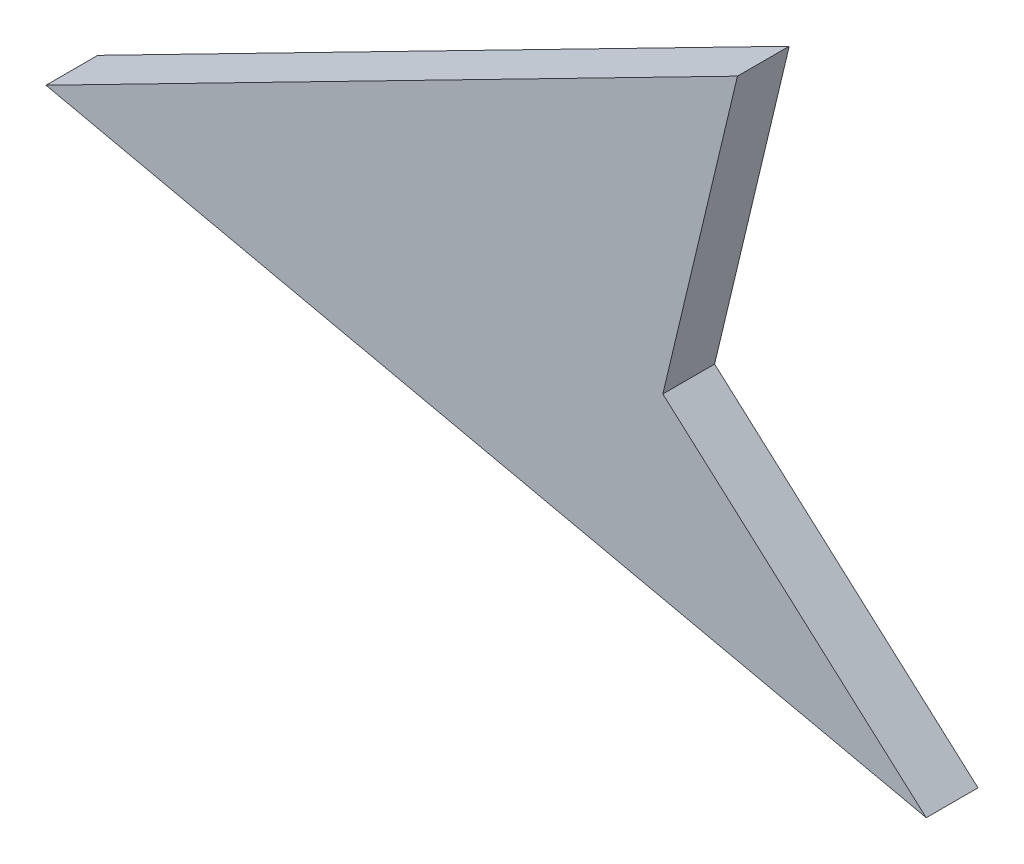
ISO-10303-21;
HEADER;
FILE_DESCRIPTION(('STEP AP214'),'2;1');
FILE_NAME('part.step','',(''),(''),'','','');
FILE_SCHEMA(('AUTOMOTIVE_DESIGN { 1 0 10303 214 1 1 1 1 }'));
ENDSEC;
DATA;
#1=APPLICATION_CONTEXT('core data for automotive mechanical design processes');
#2=APPLICATION_PROTOCOL_DEFINITION('international standard','automotive_design',2000,#1);
#3=PRODUCT_CONTEXT('',#1,'mechanical');
#4=PRODUCT('Part','Part','',(#3));
#5=PRODUCT_RELATED_PRODUCT_CATEGORY('part','',(#4));
#6=PRODUCT_DEFINITION_FORMATION('','',#4);
#7=PRODUCT_DEFINITION_CONTEXT('part definition',#1,'design');
#8=PRODUCT_DEFINITION('design','',#6,#7);
#9=PRODUCT_DEFINITION_SHAPE('','',#8);
#10=(LENGTH_UNIT() NAMED_UNIT(*) SI_UNIT(.MILLI.,.METRE.));
#11=(NAMED_UNIT(*) PLANE_ANGLE_UNIT() SI_UNIT($,.RADIAN.));
#12=(NAMED_UNIT(*) SI_UNIT($,.STERADIAN.) SOLID_ANGLE_UNIT());
#13=UNCERTAINTY_MEASURE_WITH_UNIT(LENGTH_MEASURE(1.E-05),#10,'distance_accuracy_value','');
#14=(GEOMETRIC_REPRESENTATION_CONTEXT(3) GLOBAL_UNCERTAINTY_ASSIGNED_CONTEXT((#13)) GLOBAL_UNIT_ASSIGNED_CONTEXT((#10,
#11,#12)) REPRESENTATION_CONTEXT('',''));
#15=CARTESIAN_POINT('',(0.,0.,0.));
#16=DIRECTION('',(0.,0.,1.));
#17=DIRECTION('',(1.,0.,0.));
#18=AXIS2_PLACEMENT_3D('',#15,#16,#17);
#19=CARTESIAN_POINT('',(34.0021892817699,-7.50455859797228,2.));
#20=DIRECTION('',(0.215521271272873,0.976499145738963,0.));
#21=DIRECTION('',(-0.976499145738963,0.215521271272873,0.));
#22=AXIS2_PLACEMENT_3D('',#19,#20,#21);
#23=PLANE('',#22);
#24=DIRECTION('',(0.976499145738963,-0.215521271272873,0.));
#25=VECTOR('',#24,1.);
#26=CARTESIAN_POINT('',(34.0021892817699,-7.50455859797228,0.));
#27=LINE('',#26,#25);
#28=CARTESIAN_POINT('',(0.,0.,0.));
#29=VERTEX_POINT('',#28);
#30=CARTESIAN_POINT('',(34.0021892817699,-7.50455859797228,0.));
#31=VERTEX_POINT('',#30);
#32=EDGE_CURVE('E100',#29,#31,#27,.T.);
#33=ORIENTED_EDGE('',*,*,#32,.T.);
#34=DIRECTION('',(0.,0.,-1.));
#35=VECTOR('',#34,1.);
#36=CARTESIAN_POINT('',(34.0021892817699,-7.50455859797228,2.));
#37=LINE('',#36,#35);
#38=CARTESIAN_POINT('',(34.0021892817699,-7.50455859797228,2.));
#39=VERTEX_POINT('',#38);
#40=EDGE_CURVE('E11',#39,#31,#37,.T.);
#41=ORIENTED_EDGE('',*,*,#40,.F.);
#42=DIRECTION('',(0.976499145738963,-0.215521271272873,0.));
#43=VECTOR('',#42,1.);
#44=CARTESIAN_POINT('',(34.0021892817699,-7.50455859797228,2.));
#45=LINE('',#44,#43);
#46=CARTESIAN_POINT('',(0.,0.,2.));
#47=VERTEX_POINT('',#46);
#48=EDGE_CURVE('E88',#47,#39,#45,.T.);
#49=ORIENTED_EDGE('',*,*,#48,.F.);
#50=DIRECTION('',(0.,0.,-1.));
#51=VECTOR('',#50,1.);
#52=CARTESIAN_POINT('',(0.,0.,2.));
#53=LINE('',#52,#51);
#54=EDGE_CURVE('E96',#47,#29,#53,.T.);
#55=ORIENTED_EDGE('',*,*,#54,.T.);
#56=EDGE_LOOP('',(#33,#41,#49,#55));
#57=FACE_BOUND('',#56,.T.);
#58=ADVANCED_FACE('F37',(#57),#23,.F.);
#59=CARTESIAN_POINT('',(23.8273410774674,1.5841894798001,2.));
#60=DIRECTION('',(-0.666181426288507,-0.745789720543406,0.));
#61=DIRECTION('',(0.745789720543406,-0.666181426288507,0.));
#62=AXIS2_PLACEMENT_3D('',#59,#60,#61);
#63=PLANE('',#62);
#64=DIRECTION('',(-0.745789720543406,0.666181426288507,0.));
#65=VECTOR('',#64,1.);
#66=CARTESIAN_POINT('',(23.8273410774674,1.5841894798001,0.));
#67=LINE('',#66,#65);
#68=CARTESIAN_POINT('',(23.8273410774674,1.5841894798001,0.));
#69=VERTEX_POINT('',#68);
#70=EDGE_CURVE('E92',#31,#69,#67,.T.);
#71=ORIENTED_EDGE('',*,*,#70,.T.);
#72=DIRECTION('',(0.,0.,-1.));
#73=VECTOR('',#72,1.);
#74=CARTESIAN_POINT('',(23.8273410774674,1.5841894798001,2.));
#75=LINE('',#74,#73);
#76=CARTESIAN_POINT('',(23.8273410774674,1.5841894798001,2.));
#77=VERTEX_POINT('',#76);
#78=EDGE_CURVE('E45',#77,#69,#75,.T.);
#79=ORIENTED_EDGE('',*,*,#78,.F.);
#80=DIRECTION('',(-0.745789720543406,0.666181426288507,0.));
#81=VECTOR('',#80,1.);
#82=CARTESIAN_POINT('',(23.8273410774674,1.5841894798001,2.));
#83=LINE('',#82,#81);
#84=EDGE_CURVE('E83',#39,#77,#83,.T.);
#85=ORIENTED_EDGE('',*,*,#84,.F.);
#86=ORIENTED_EDGE('',*,*,#40,.T.);
#87=EDGE_LOOP('',(#71,#79,#85,#86));
#88=FACE_BOUND('',#87,.T.);
#89=ADVANCED_FACE('F91',(#88),#63,.F.);
#90=CARTESIAN_POINT('',(26.7100659226524,13.6591499884715,2.));
#91=DIRECTION('',(-0.97266565792854,0.232210072749742,0.));
#92=DIRECTION('',(-0.232210072749742,-0.97266565792854,0.));
#93=AXIS2_PLACEMENT_3D('',#90,#91,#92);
#94=PLANE('',#93);
#95=DIRECTION('',(0.232210072749742,0.97266565792854,0.));
#96=VECTOR('',#95,1.);
#97=CARTESIAN_POINT('',(26.7100659226524,13.6591499884715,0.));
#98=LINE('',#97,#96);
#99=CARTESIAN_POINT('',(26.7100659226524,13.6591499884715,0.));
#100=VERTEX_POINT('',#99);
#101=EDGE_CURVE('E70',#69,#100,#98,.T.);
#102=ORIENTED_EDGE('',*,*,#101,.T.);
#103=DIRECTION('',(0.,0.,-1.));
#104=VECTOR('',#103,1.);
#105=CARTESIAN_POINT('',(26.7100659226524,13.6591499884715,2.));
#106=LINE('',#105,#104);
#107=CARTESIAN_POINT('',(26.7100659226524,13.6591499884715,2.));
#108=VERTEX_POINT('',#107);
#109=EDGE_CURVE('E93',#108,#100,#106,.T.);
#110=ORIENTED_EDGE('',*,*,#109,.F.);
#111=DIRECTION('',(0.232210072749742,0.97266565792854,0.));
#112=VECTOR('',#111,1.);
#113=CARTESIAN_POINT('',(26.7100659226524,13.6591499884715,2.));
#114=LINE('',#113,#112);
#115=EDGE_CURVE('E86',#77,#108,#114,.T.);
#116=ORIENTED_EDGE('',*,*,#115,.F.);
#117=ORIENTED_EDGE('',*,*,#78,.T.);
#118=EDGE_LOOP('',(#102,#110,#116,#117));
#119=FACE_BOUND('',#118,.T.);
#120=ADVANCED_FACE('F94',(#119),#94,.F.);
#121=CARTESIAN_POINT('',(0.,0.,2.));
#122=DIRECTION('',(0.455304999615716,-0.890335530755082,0.));
#123=DIRECTION('',(0.890335530755082,0.455304999615716,0.));
#124=AXIS2_PLACEMENT_3D('',#121,#122,#123);
#125=PLANE('',#124);
#126=DIRECTION('',(-0.890335530755082,-0.455304999615716,0.));
#127=VECTOR('',#126,1.);
#128=CARTESIAN_POINT('',(0.,0.,0.));
#129=LINE('',#128,#127);
#130=EDGE_CURVE('E76',#100,#29,#129,.T.);
#131=ORIENTED_EDGE('',*,*,#130,.T.);
#132=ORIENTED_EDGE('',*,*,#54,.F.);
#133=DIRECTION('',(-0.890335530755082,-0.455304999615716,0.));
#134=VECTOR('',#133,1.);
#135=CARTESIAN_POINT('',(0.,0.,2.));
#136=LINE('',#135,#134);
#137=EDGE_CURVE('E53',#108,#47,#136,.T.);
#138=ORIENTED_EDGE('',*,*,#137,.F.);
#139=ORIENTED_EDGE('',*,*,#109,.T.);
#140=EDGE_LOOP('',(#131,#132,#138,#139));
#141=FACE_BOUND('',#140,.T.);
#142=ADVANCED_FACE('F107',(#141),#125,.F.);
#143=CARTESIAN_POINT('',(0.,0.,2.));
#144=DIRECTION('',(0.,0.,1.));
#145=DIRECTION('',(1.,0.,0.));
#146=AXIS2_PLACEMENT_3D('',#143,#144,#145);
#147=PLANE('',#146);
#148=ORIENTED_EDGE('',*,*,#48,.T.);
#149=ORIENTED_EDGE('',*,*,#84,.T.);
#150=ORIENTED_EDGE('',*,*,#115,.T.);
#151=ORIENTED_EDGE('',*,*,#137,.T.);
#152=EDGE_LOOP('',(#148,#149,#150,#151));
#153=FACE_BOUND('',#152,.T.);
#154=ADVANCED_FACE('F84',(#153),#147,.T.);
#155=CARTESIAN_POINT('',(0.,0.,0.));
#156=DIRECTION('',(0.,0.,1.));
#157=DIRECTION('',(1.,0.,0.));
#158=AXIS2_PLACEMENT_3D('',#155,#156,#157);
#159=PLANE('',#158);
#160=ORIENTED_EDGE('',*,*,#32,.F.);
#161=ORIENTED_EDGE('',*,*,#130,.F.);
#162=ORIENTED_EDGE('',*,*,#101,.F.);
#163=ORIENTED_EDGE('',*,*,#70,.F.);
#164=EDGE_LOOP('',(#160,#161,#162,#163));
#165=FACE_BOUND('',#164,.T.);
#166=ADVANCED_FACE('F110',(#165),#159,.F.);
#167=CLOSED_SHELL('',(#58,#89,#120,#142,#154,#166));
#168=MANIFOLD_SOLID_BREP('B2',#167);
#169=ADVANCED_BREP_SHAPE_REPRESENTATION('',(#18,#168),#14);
#170=SHAPE_DEFINITION_REPRESENTATION(#9,#169);
ENDSEC;
END-ISO-10303-21;
